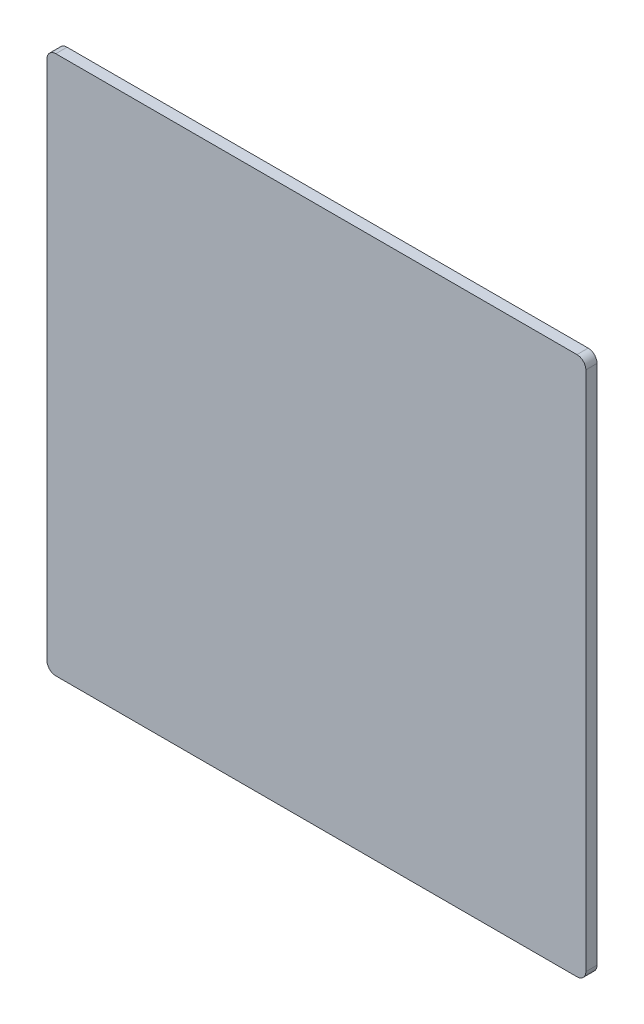
ISO-10303-21;
HEADER;
FILE_DESCRIPTION(('STEP AP214'),'2;1');
FILE_NAME('part.step','',(''),(''),'','','');
FILE_SCHEMA(('AUTOMOTIVE_DESIGN { 1 0 10303 214 1 1 1 1 }'));
ENDSEC;
DATA;
#1=APPLICATION_CONTEXT('core data for automotive mechanical design processes');
#2=APPLICATION_PROTOCOL_DEFINITION('international standard','automotive_design',2000,#1);
#3=PRODUCT_CONTEXT('',#1,'mechanical');
#4=PRODUCT('Part','Part','',(#3));
#5=PRODUCT_RELATED_PRODUCT_CATEGORY('part','',(#4));
#6=PRODUCT_DEFINITION_FORMATION('','',#4);
#7=PRODUCT_DEFINITION_CONTEXT('part definition',#1,'design');
#8=PRODUCT_DEFINITION('design','',#6,#7);
#9=PRODUCT_DEFINITION_SHAPE('','',#8);
#10=(LENGTH_UNIT() NAMED_UNIT(*) SI_UNIT(.MILLI.,.METRE.));
#11=(NAMED_UNIT(*) PLANE_ANGLE_UNIT() SI_UNIT($,.RADIAN.));
#12=(NAMED_UNIT(*) SI_UNIT($,.STERADIAN.) SOLID_ANGLE_UNIT());
#13=UNCERTAINTY_MEASURE_WITH_UNIT(LENGTH_MEASURE(1.E-05),#10,'distance_accuracy_value','');
#14=(GEOMETRIC_REPRESENTATION_CONTEXT(3) GLOBAL_UNCERTAINTY_ASSIGNED_CONTEXT((#13)) GLOBAL_UNIT_ASSIGNED_CONTEXT((#10,
#11,#12)) REPRESENTATION_CONTEXT('',''));
#15=CARTESIAN_POINT('',(0.,0.,0.));
#16=DIRECTION('',(0.,0.,1.));
#17=DIRECTION('',(1.,0.,0.));
#18=AXIS2_PLACEMENT_3D('',#15,#16,#17);
#19=CARTESIAN_POINT('',(-438.398046875,137.467578125,12.7));
#20=DIRECTION('',(1.,0.,0.));
#21=DIRECTION('',(0.,0.,-1.));
#22=AXIS2_PLACEMENT_3D('',#19,#20,#21);
#23=PLANE('',#22);
#24=DIRECTION('',(0.,-1.,0.));
#25=VECTOR('',#24,1.);
#26=CARTESIAN_POINT('',(-438.398046875,137.467578125,0.));
#27=LINE('',#26,#25);
#28=CARTESIAN_POINT('',(-438.398046875,127.467578125,0.));
#29=VERTEX_POINT('',#28);
#30=CARTESIAN_POINT('',(-438.398046875,-462.132421875,0.));
#31=VERTEX_POINT('',#30);
#32=EDGE_CURVE('E186',#29,#31,#27,.T.);
#33=ORIENTED_EDGE('',*,*,#32,.T.);
#34=DIRECTION('',(0.,0.,-1.));
#35=VECTOR('',#34,1.);
#36=CARTESIAN_POINT('',(-438.398046875,-462.132421875,12.7));
#37=LINE('',#36,#35);
#38=CARTESIAN_POINT('',(-438.398046875,-462.132421875,12.7));
#39=VERTEX_POINT('',#38);
#40=EDGE_CURVE('E171',#31,#39,#37,.F.);
#41=ORIENTED_EDGE('',*,*,#40,.T.);
#42=DIRECTION('',(0.,-1.,0.));
#43=VECTOR('',#42,1.);
#44=CARTESIAN_POINT('',(-438.398046875,137.467578125,12.7));
#45=LINE('',#44,#43);
#46=CARTESIAN_POINT('',(-438.398046875,127.467578125,12.7));
#47=VERTEX_POINT('',#46);
#48=EDGE_CURVE('E188',#47,#39,#45,.T.);
#49=ORIENTED_EDGE('',*,*,#48,.F.);
#50=DIRECTION('',(0.,0.,-1.));
#51=VECTOR('',#50,1.);
#52=CARTESIAN_POINT('',(-438.398046875,127.467578125,0.));
#53=LINE('',#52,#51);
#54=EDGE_CURVE('E167',#47,#29,#53,.T.);
#55=ORIENTED_EDGE('',*,*,#54,.T.);
#56=EDGE_LOOP('',(#33,#41,#49,#55));
#57=FACE_BOUND('',#56,.T.);
#58=ADVANCED_FACE('F43',(#57),#23,.F.);
#59=CARTESIAN_POINT('',(-438.398046875,-472.132421875,12.7));
#60=DIRECTION('',(0.,1.,0.));
#61=DIRECTION('',(0.,0.,1.));
#62=AXIS2_PLACEMENT_3D('',#59,#60,#61);
#63=PLANE('',#62);
#64=DIRECTION('',(1.,0.,0.));
#65=VECTOR('',#64,1.);
#66=CARTESIAN_POINT('',(-438.398046875,-472.132421875,0.));
#67=LINE('',#66,#65);
#68=CARTESIAN_POINT('',(-428.398046875,-472.132421875,0.));
#69=VERTEX_POINT('',#68);
#70=CARTESIAN_POINT('',(161.201953125,-472.132421875,0.));
#71=VERTEX_POINT('',#70);
#72=EDGE_CURVE('E129',#69,#71,#67,.T.);
#73=ORIENTED_EDGE('',*,*,#72,.T.);
#74=DIRECTION('',(0.,0.,-1.));
#75=VECTOR('',#74,1.);
#76=CARTESIAN_POINT('',(161.201953125,-472.132421875,12.7));
#77=LINE('',#76,#75);
#78=CARTESIAN_POINT('',(161.201953125,-472.132421875,12.7));
#79=VERTEX_POINT('',#78);
#80=EDGE_CURVE('E153',#71,#79,#77,.F.);
#81=ORIENTED_EDGE('',*,*,#80,.T.);
#82=DIRECTION('',(1.,0.,0.));
#83=VECTOR('',#82,1.);
#84=CARTESIAN_POINT('',(-438.398046875,-472.132421875,12.7));
#85=LINE('',#84,#83);
#86=CARTESIAN_POINT('',(-428.398046875,-472.132421875,12.7));
#87=VERTEX_POINT('',#86);
#88=EDGE_CURVE('E198',#87,#79,#85,.T.);
#89=ORIENTED_EDGE('',*,*,#88,.F.);
#90=DIRECTION('',(0.,0.,-1.));
#91=VECTOR('',#90,1.);
#92=CARTESIAN_POINT('',(-428.398046875,-472.132421875,12.7));
#93=LINE('',#92,#91);
#94=EDGE_CURVE('E149',#87,#69,#93,.T.);
#95=ORIENTED_EDGE('',*,*,#94,.T.);
#96=EDGE_LOOP('',(#73,#81,#89,#95));
#97=FACE_BOUND('',#96,.T.);
#98=ADVANCED_FACE('F209',(#97),#63,.F.);
#99=CARTESIAN_POINT('',(171.201953125,137.467578125,12.7));
#100=DIRECTION('',(1.,0.,0.));
#101=DIRECTION('',(0.,1.,0.));
#102=AXIS2_PLACEMENT_3D('',#99,#100,#101);
#103=PLANE('',#102);
#104=DIRECTION('',(0.,-1.,0.));
#105=VECTOR('',#104,1.);
#106=CARTESIAN_POINT('',(171.201953125,137.467578125,12.7));
#107=LINE('',#106,#105);
#108=CARTESIAN_POINT('',(171.201953125,127.467578125,12.7));
#109=VERTEX_POINT('',#108);
#110=CARTESIAN_POINT('',(171.201953125,-462.132421875,12.7));
#111=VERTEX_POINT('',#110);
#112=EDGE_CURVE('E137',#109,#111,#107,.T.);
#113=ORIENTED_EDGE('',*,*,#112,.T.);
#114=DIRECTION('',(0.,0.,-1.));
#115=VECTOR('',#114,1.);
#116=CARTESIAN_POINT('',(171.201953125,-462.132421875,0.));
#117=LINE('',#116,#115);
#118=CARTESIAN_POINT('',(171.201953125,-462.132421875,0.));
#119=VERTEX_POINT('',#118);
#120=EDGE_CURVE('E120',#111,#119,#117,.T.);
#121=ORIENTED_EDGE('',*,*,#120,.T.);
#122=DIRECTION('',(0.,-1.,0.));
#123=VECTOR('',#122,1.);
#124=CARTESIAN_POINT('',(171.201953125,137.467578125,0.));
#125=LINE('',#124,#123);
#126=CARTESIAN_POINT('',(171.201953125,127.467578125,0.));
#127=VERTEX_POINT('',#126);
#128=EDGE_CURVE('E112',#127,#119,#125,.T.);
#129=ORIENTED_EDGE('',*,*,#128,.F.);
#130=DIRECTION('',(0.,0.,-1.));
#131=VECTOR('',#130,1.);
#132=CARTESIAN_POINT('',(171.201953125,127.467578125,12.7));
#133=LINE('',#132,#131);
#134=EDGE_CURVE('E126',#127,#109,#133,.F.);
#135=ORIENTED_EDGE('',*,*,#134,.T.);
#136=EDGE_LOOP('',(#113,#121,#129,#135));
#137=FACE_BOUND('',#136,.T.);
#138=ADVANCED_FACE('F125',(#137),#103,.T.);
#139=CARTESIAN_POINT('',(-438.398046875,137.467578125,12.7));
#140=DIRECTION('',(0.,1.,0.));
#141=DIRECTION('',(0.,0.,1.));
#142=AXIS2_PLACEMENT_3D('',#139,#140,#141);
#143=PLANE('',#142);
#144=DIRECTION('',(1.,0.,0.));
#145=VECTOR('',#144,1.);
#146=CARTESIAN_POINT('',(-438.398046875,137.467578125,0.));
#147=LINE('',#146,#145);
#148=CARTESIAN_POINT('',(-428.398046875,137.467578125,0.));
#149=VERTEX_POINT('',#148);
#150=CARTESIAN_POINT('',(161.201953125,137.467578125,0.));
#151=VERTEX_POINT('',#150);
#152=EDGE_CURVE('E113',#149,#151,#147,.T.);
#153=ORIENTED_EDGE('',*,*,#152,.F.);
#154=DIRECTION('',(0.,0.,-1.));
#155=VECTOR('',#154,1.);
#156=CARTESIAN_POINT('',(-428.398046875,137.467578125,12.7));
#157=LINE('',#156,#155);
#158=CARTESIAN_POINT('',(-428.398046875,137.467578125,12.7));
#159=VERTEX_POINT('',#158);
#160=EDGE_CURVE('E11',#149,#159,#157,.F.);
#161=ORIENTED_EDGE('',*,*,#160,.T.);
#162=DIRECTION('',(1.,0.,0.));
#163=VECTOR('',#162,1.);
#164=CARTESIAN_POINT('',(-438.398046875,137.467578125,12.7));
#165=LINE('',#164,#163);
#166=CARTESIAN_POINT('',(161.201953125,137.467578125,12.7));
#167=VERTEX_POINT('',#166);
#168=EDGE_CURVE('E132',#159,#167,#165,.T.);
#169=ORIENTED_EDGE('',*,*,#168,.T.);
#170=DIRECTION('',(0.,0.,-1.));
#171=VECTOR('',#170,1.);
#172=CARTESIAN_POINT('',(161.201953125,137.467578125,12.7));
#173=LINE('',#172,#171);
#174=EDGE_CURVE('E52',#167,#151,#173,.T.);
#175=ORIENTED_EDGE('',*,*,#174,.T.);
#176=EDGE_LOOP('',(#153,#161,#169,#175));
#177=FACE_BOUND('',#176,.T.);
#178=ADVANCED_FACE('F174',(#177),#143,.T.);
#179=CARTESIAN_POINT('',(0.,0.,12.7));
#180=DIRECTION('',(0.,0.,1.));
#181=DIRECTION('',(1.,0.,0.));
#182=AXIS2_PLACEMENT_3D('',#179,#180,#181);
#183=PLANE('',#182);
#184=ORIENTED_EDGE('',*,*,#88,.T.);
#185=CARTESIAN_POINT('',(161.201953125,-462.132421875,12.7));
#186=DIRECTION('',(0.,0.,1.));
#187=DIRECTION('',(1.,0.,0.));
#188=AXIS2_PLACEMENT_3D('',#185,#186,#187);
#189=CIRCLE('',#188,10.);
#190=EDGE_CURVE('E164',#79,#111,#189,.T.);
#191=ORIENTED_EDGE('',*,*,#190,.T.);
#192=ORIENTED_EDGE('',*,*,#112,.F.);
#193=CARTESIAN_POINT('',(161.201953125,127.467578125,12.7));
#194=DIRECTION('',(0.,0.,1.));
#195=DIRECTION('',(1.,0.,0.));
#196=AXIS2_PLACEMENT_3D('',#193,#194,#195);
#197=CIRCLE('',#196,10.);
#198=EDGE_CURVE('E59',#109,#167,#197,.T.);
#199=ORIENTED_EDGE('',*,*,#198,.T.);
#200=ORIENTED_EDGE('',*,*,#168,.F.);
#201=CARTESIAN_POINT('',(-428.398046875,127.467578125,12.7));
#202=DIRECTION('',(0.,0.,1.));
#203=DIRECTION('',(1.,0.,0.));
#204=AXIS2_PLACEMENT_3D('',#201,#202,#203);
#205=CIRCLE('',#204,10.);
#206=EDGE_CURVE('E158',#159,#47,#205,.T.);
#207=ORIENTED_EDGE('',*,*,#206,.T.);
#208=ORIENTED_EDGE('',*,*,#48,.T.);
#209=CARTESIAN_POINT('',(-428.398046875,-462.132421875,12.7));
#210=DIRECTION('',(0.,0.,1.));
#211=DIRECTION('',(1.,0.,0.));
#212=AXIS2_PLACEMENT_3D('',#209,#210,#211);
#213=CIRCLE('',#212,10.);
#214=EDGE_CURVE('E161',#39,#87,#213,.T.);
#215=ORIENTED_EDGE('',*,*,#214,.T.);
#216=EDGE_LOOP('',(#184,#191,#192,#199,#200,#207,#208,#215));
#217=FACE_BOUND('',#216,.T.);
#218=ADVANCED_FACE('F177',(#217),#183,.T.);
#219=CARTESIAN_POINT('',(0.,0.,0.));
#220=DIRECTION('',(0.,0.,1.));
#221=DIRECTION('',(1.,0.,0.));
#222=AXIS2_PLACEMENT_3D('',#219,#220,#221);
#223=PLANE('',#222);
#224=ORIENTED_EDGE('',*,*,#128,.T.);
#225=CARTESIAN_POINT('',(161.201953125,-462.132421875,0.));
#226=DIRECTION('',(0.,0.,1.));
#227=DIRECTION('',(1.,0.,0.));
#228=AXIS2_PLACEMENT_3D('',#225,#226,#227);
#229=CIRCLE('',#228,10.);
#230=EDGE_CURVE('E146',#119,#71,#229,.F.);
#231=ORIENTED_EDGE('',*,*,#230,.T.);
#232=ORIENTED_EDGE('',*,*,#72,.F.);
#233=CARTESIAN_POINT('',(-428.398046875,-462.132421875,0.));
#234=DIRECTION('',(0.,0.,1.));
#235=DIRECTION('',(1.,0.,0.));
#236=AXIS2_PLACEMENT_3D('',#233,#234,#235);
#237=CIRCLE('',#236,10.);
#238=EDGE_CURVE('E143',#69,#31,#237,.F.);
#239=ORIENTED_EDGE('',*,*,#238,.T.);
#240=ORIENTED_EDGE('',*,*,#32,.F.);
#241=CARTESIAN_POINT('',(-428.398046875,127.467578125,0.));
#242=DIRECTION('',(0.,0.,1.));
#243=DIRECTION('',(1.,0.,0.));
#244=AXIS2_PLACEMENT_3D('',#241,#242,#243);
#245=CIRCLE('',#244,10.);
#246=EDGE_CURVE('E119',#29,#149,#245,.F.);
#247=ORIENTED_EDGE('',*,*,#246,.T.);
#248=ORIENTED_EDGE('',*,*,#152,.T.);
#249=CARTESIAN_POINT('',(161.201953125,127.467578125,0.));
#250=DIRECTION('',(0.,0.,1.));
#251=DIRECTION('',(1.,0.,0.));
#252=AXIS2_PLACEMENT_3D('',#249,#250,#251);
#253=CIRCLE('',#252,10.);
#254=EDGE_CURVE('E109',#151,#127,#253,.F.);
#255=ORIENTED_EDGE('',*,*,#254,.T.);
#256=EDGE_LOOP('',(#224,#231,#232,#239,#240,#247,#248,#255));
#257=FACE_BOUND('',#256,.T.);
#258=ADVANCED_FACE('F111',(#257),#223,.F.);
#259=CARTESIAN_POINT('',(161.201953125,-462.132421875,12.7));
#260=DIRECTION('',(0.,0.,1.));
#261=DIRECTION('',(1.,0.,0.));
#262=AXIS2_PLACEMENT_3D('',#259,#260,#261);
#263=CYLINDRICAL_SURFACE('',#262,10.);
#264=ORIENTED_EDGE('',*,*,#190,.F.);
#265=ORIENTED_EDGE('',*,*,#80,.F.);
#266=ORIENTED_EDGE('',*,*,#230,.F.);
#267=ORIENTED_EDGE('',*,*,#120,.F.);
#268=EDGE_LOOP('',(#264,#265,#266,#267));
#269=FACE_BOUND('',#268,.T.);
#270=ADVANCED_FACE('F213',(#269),#263,.T.);
#271=CARTESIAN_POINT('',(-428.398046875,-462.132421875,12.7));
#272=DIRECTION('',(0.,0.,-1.));
#273=DIRECTION('',(-1.,0.,0.));
#274=AXIS2_PLACEMENT_3D('',#271,#272,#273);
#275=CYLINDRICAL_SURFACE('',#274,10.);
#276=ORIENTED_EDGE('',*,*,#214,.F.);
#277=ORIENTED_EDGE('',*,*,#40,.F.);
#278=ORIENTED_EDGE('',*,*,#238,.F.);
#279=ORIENTED_EDGE('',*,*,#94,.F.);
#280=EDGE_LOOP('',(#276,#277,#278,#279));
#281=FACE_BOUND('',#280,.T.);
#282=ADVANCED_FACE('F207',(#281),#275,.T.);
#283=CARTESIAN_POINT('',(-428.398046875,127.467578125,12.7));
#284=DIRECTION('',(0.,0.,1.));
#285=DIRECTION('',(1.,0.,0.));
#286=AXIS2_PLACEMENT_3D('',#283,#284,#285);
#287=CYLINDRICAL_SURFACE('',#286,10.);
#288=ORIENTED_EDGE('',*,*,#206,.F.);
#289=ORIENTED_EDGE('',*,*,#160,.F.);
#290=ORIENTED_EDGE('',*,*,#246,.F.);
#291=ORIENTED_EDGE('',*,*,#54,.F.);
#292=EDGE_LOOP('',(#288,#289,#290,#291));
#293=FACE_BOUND('',#292,.T.);
#294=ADVANCED_FACE('F182',(#293),#287,.T.);
#295=CARTESIAN_POINT('',(161.201953125,127.467578125,12.7));
#296=DIRECTION('',(0.,0.,-1.));
#297=DIRECTION('',(-1.,0.,0.));
#298=AXIS2_PLACEMENT_3D('',#295,#296,#297);
#299=CYLINDRICAL_SURFACE('',#298,10.);
#300=ORIENTED_EDGE('',*,*,#198,.F.);
#301=ORIENTED_EDGE('',*,*,#134,.F.);
#302=ORIENTED_EDGE('',*,*,#254,.F.);
#303=ORIENTED_EDGE('',*,*,#174,.F.);
#304=EDGE_LOOP('',(#300,#301,#302,#303));
#305=FACE_BOUND('',#304,.T.);
#306=ADVANCED_FACE('F45',(#305),#299,.T.);
#307=CLOSED_SHELL('',(#58,#98,#138,#178,#218,#258,#270,#282,#294,#306));
#308=MANIFOLD_SOLID_BREP('B2',#307);
#309=ADVANCED_BREP_SHAPE_REPRESENTATION('',(#18,#308),#14);
#310=SHAPE_DEFINITION_REPRESENTATION(#9,#309);
ENDSEC;
END-ISO-10303-21;
